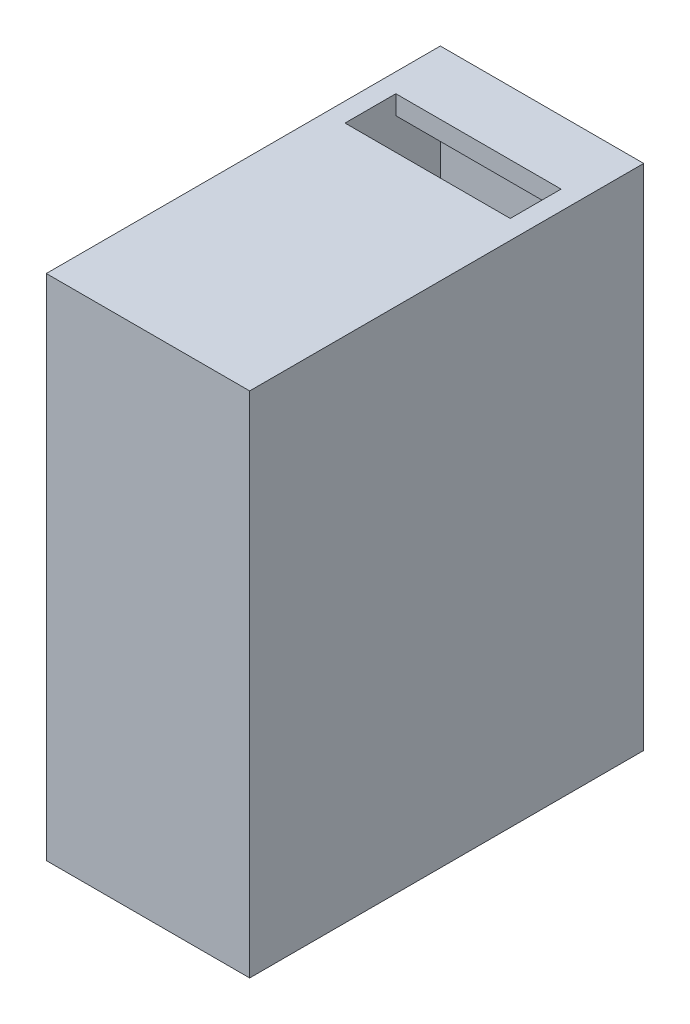
ISO-10303-21;
HEADER;
FILE_DESCRIPTION(('STEP AP214'),'2;1');
FILE_NAME('part.step','',(''),(''),'','','');
FILE_SCHEMA(('AUTOMOTIVE_DESIGN { 1 0 10303 214 1 1 1 1 }'));
ENDSEC;
DATA;
#1=APPLICATION_CONTEXT('core data for automotive mechanical design processes');
#2=APPLICATION_PROTOCOL_DEFINITION('international standard','automotive_design',2000,#1);
#3=PRODUCT_CONTEXT('',#1,'mechanical');
#4=PRODUCT('Part','Part','',(#3));
#5=PRODUCT_RELATED_PRODUCT_CATEGORY('part','',(#4));
#6=PRODUCT_DEFINITION_FORMATION('','',#4);
#7=PRODUCT_DEFINITION_CONTEXT('part definition',#1,'design');
#8=PRODUCT_DEFINITION('design','',#6,#7);
#9=PRODUCT_DEFINITION_SHAPE('','',#8);
#10=(LENGTH_UNIT() NAMED_UNIT(*) SI_UNIT(.MILLI.,.METRE.));
#11=(NAMED_UNIT(*) PLANE_ANGLE_UNIT() SI_UNIT($,.RADIAN.));
#12=(NAMED_UNIT(*) SI_UNIT($,.STERADIAN.) SOLID_ANGLE_UNIT());
#13=UNCERTAINTY_MEASURE_WITH_UNIT(LENGTH_MEASURE(1.E-05),#10,'distance_accuracy_value','');
#14=(GEOMETRIC_REPRESENTATION_CONTEXT(3) GLOBAL_UNCERTAINTY_ASSIGNED_CONTEXT((#13)) GLOBAL_UNIT_ASSIGNED_CONTEXT((#10,
#11,#12)) REPRESENTATION_CONTEXT('',''));
#15=CARTESIAN_POINT('',(0.,0.,0.));
#16=DIRECTION('',(0.,0.,1.));
#17=DIRECTION('',(1.,0.,0.));
#18=AXIS2_PLACEMENT_3D('',#15,#16,#17);
#19=CARTESIAN_POINT('',(0.,38.5,0.));
#20=DIRECTION('',(0.,1.,0.));
#21=DIRECTION('',(0.,0.,1.));
#22=AXIS2_PLACEMENT_3D('',#19,#20,#21);
#23=PLANE('',#22);
#24=DIRECTION('',(0.,0.,-1.));
#25=VECTOR('',#24,1.);
#26=CARTESIAN_POINT('',(14.5,38.5,0.));
#27=LINE('',#26,#25);
#28=CARTESIAN_POINT('',(14.5,38.5,5.));
#29=VERTEX_POINT('',#28);
#30=CARTESIAN_POINT('',(14.5,38.5,1.5));
#31=VERTEX_POINT('',#30);
#32=EDGE_CURVE('E262',#29,#31,#27,.T.);
#33=ORIENTED_EDGE('',*,*,#32,.F.);
#34=DIRECTION('',(-1.,0.,0.));
#35=VECTOR('',#34,1.);
#36=CARTESIAN_POINT('',(1.5,38.5,5.));
#37=LINE('',#36,#35);
#38=CARTESIAN_POINT('',(1.5,38.5,5.));
#39=VERTEX_POINT('',#38);
#40=EDGE_CURVE('E208',#29,#39,#37,.T.);
#41=ORIENTED_EDGE('',*,*,#40,.T.);
#42=DIRECTION('',(0.,0.,1.));
#43=VECTOR('',#42,1.);
#44=CARTESIAN_POINT('',(1.5,38.5,0.));
#45=LINE('',#44,#43);
#46=CARTESIAN_POINT('',(1.5,38.5,1.5));
#47=VERTEX_POINT('',#46);
#48=EDGE_CURVE('E244',#47,#39,#45,.T.);
#49=ORIENTED_EDGE('',*,*,#48,.F.);
#50=DIRECTION('',(-1.,0.,0.));
#51=VECTOR('',#50,1.);
#52=CARTESIAN_POINT('',(0.,38.5,1.5));
#53=LINE('',#52,#51);
#54=EDGE_CURVE('E270',#31,#47,#53,.T.);
#55=ORIENTED_EDGE('',*,*,#54,.F.);
#56=EDGE_LOOP('',(#33,#41,#49,#55));
#57=FACE_BOUND('',#56,.T.);
#58=ADVANCED_FACE('F39',(#57),#23,.F.);
#59=CARTESIAN_POINT('',(0.,40.,0.));
#60=DIRECTION('',(1.,0.,0.));
#61=DIRECTION('',(0.,0.,-1.));
#62=AXIS2_PLACEMENT_3D('',#59,#60,#61);
#63=PLANE('',#62);
#64=DIRECTION('',(0.,0.,1.));
#65=VECTOR('',#64,1.);
#66=CARTESIAN_POINT('',(0.,0.,0.));
#67=LINE('',#66,#65);
#68=CARTESIAN_POINT('',(0.,0.,0.));
#69=VERTEX_POINT('',#68);
#70=CARTESIAN_POINT('',(0.,0.,31.));
#71=VERTEX_POINT('',#70);
#72=EDGE_CURVE('E242',#69,#71,#67,.T.);
#73=ORIENTED_EDGE('',*,*,#72,.T.);
#74=DIRECTION('',(0.,-1.,0.));
#75=VECTOR('',#74,1.);
#76=CARTESIAN_POINT('',(0.,40.,31.));
#77=LINE('',#76,#75);
#78=CARTESIAN_POINT('',(0.,40.,31.));
#79=VERTEX_POINT('',#78);
#80=EDGE_CURVE('E323',#79,#71,#77,.T.);
#81=ORIENTED_EDGE('',*,*,#80,.F.);
#82=DIRECTION('',(0.,0.,1.));
#83=VECTOR('',#82,1.);
#84=CARTESIAN_POINT('',(0.,40.,0.));
#85=LINE('',#84,#83);
#86=CARTESIAN_POINT('',(0.,40.,0.));
#87=VERTEX_POINT('',#86);
#88=EDGE_CURVE('E284',#87,#79,#85,.T.);
#89=ORIENTED_EDGE('',*,*,#88,.F.);
#90=DIRECTION('',(0.,-1.,0.));
#91=VECTOR('',#90,1.);
#92=CARTESIAN_POINT('',(0.,40.,0.));
#93=LINE('',#92,#91);
#94=EDGE_CURVE('E298',#87,#69,#93,.T.);
#95=ORIENTED_EDGE('',*,*,#94,.T.);
#96=EDGE_LOOP('',(#73,#81,#89,#95));
#97=FACE_BOUND('',#96,.T.);
#98=ADVANCED_FACE('F41',(#97),#63,.F.);
#99=CARTESIAN_POINT('',(0.,40.,31.));
#100=DIRECTION('',(0.,0.,-1.));
#101=DIRECTION('',(-1.,0.,0.));
#102=AXIS2_PLACEMENT_3D('',#99,#100,#101);
#103=PLANE('',#102);
#104=DIRECTION('',(1.,0.,0.));
#105=VECTOR('',#104,1.);
#106=CARTESIAN_POINT('',(0.,0.,31.));
#107=LINE('',#106,#105);
#108=CARTESIAN_POINT('',(16.,0.,31.));
#109=VERTEX_POINT('',#108);
#110=EDGE_CURVE('E302',#71,#109,#107,.T.);
#111=ORIENTED_EDGE('',*,*,#110,.T.);
#112=DIRECTION('',(0.,-1.,0.));
#113=VECTOR('',#112,1.);
#114=CARTESIAN_POINT('',(16.,40.,31.));
#115=LINE('',#114,#113);
#116=CARTESIAN_POINT('',(16.,40.,31.));
#117=VERTEX_POINT('',#116);
#118=EDGE_CURVE('E319',#117,#109,#115,.T.);
#119=ORIENTED_EDGE('',*,*,#118,.F.);
#120=DIRECTION('',(1.,0.,0.));
#121=VECTOR('',#120,1.);
#122=CARTESIAN_POINT('',(0.,40.,31.));
#123=LINE('',#122,#121);
#124=EDGE_CURVE('E288',#79,#117,#123,.T.);
#125=ORIENTED_EDGE('',*,*,#124,.F.);
#126=ORIENTED_EDGE('',*,*,#80,.T.);
#127=EDGE_LOOP('',(#111,#119,#125,#126));
#128=FACE_BOUND('',#127,.T.);
#129=ADVANCED_FACE('F400',(#128),#103,.F.);
#130=CARTESIAN_POINT('',(16.,40.,0.));
#131=DIRECTION('',(-1.,0.,0.));
#132=DIRECTION('',(0.,0.,1.));
#133=AXIS2_PLACEMENT_3D('',#130,#131,#132);
#134=PLANE('',#133);
#135=DIRECTION('',(0.,0.,-1.));
#136=VECTOR('',#135,1.);
#137=CARTESIAN_POINT('',(16.,0.,0.));
#138=LINE('',#137,#136);
#139=CARTESIAN_POINT('',(16.,0.,0.));
#140=VERTEX_POINT('',#139);
#141=EDGE_CURVE('E305',#109,#140,#138,.T.);
#142=ORIENTED_EDGE('',*,*,#141,.T.);
#143=DIRECTION('',(0.,-1.,0.));
#144=VECTOR('',#143,1.);
#145=CARTESIAN_POINT('',(16.,40.,0.));
#146=LINE('',#145,#144);
#147=CARTESIAN_POINT('',(16.,40.,0.));
#148=VERTEX_POINT('',#147);
#149=EDGE_CURVE('E315',#148,#140,#146,.T.);
#150=ORIENTED_EDGE('',*,*,#149,.F.);
#151=DIRECTION('',(0.,0.,-1.));
#152=VECTOR('',#151,1.);
#153=CARTESIAN_POINT('',(16.,40.,0.));
#154=LINE('',#153,#152);
#155=EDGE_CURVE('E292',#117,#148,#154,.T.);
#156=ORIENTED_EDGE('',*,*,#155,.F.);
#157=ORIENTED_EDGE('',*,*,#118,.T.);
#158=EDGE_LOOP('',(#142,#150,#156,#157));
#159=FACE_BOUND('',#158,.T.);
#160=ADVANCED_FACE('F427',(#159),#134,.F.);
#161=CARTESIAN_POINT('',(0.,40.,0.));
#162=DIRECTION('',(0.,0.,1.));
#163=DIRECTION('',(1.,0.,0.));
#164=AXIS2_PLACEMENT_3D('',#161,#162,#163);
#165=PLANE('',#164);
#166=DIRECTION('',(-1.,0.,0.));
#167=VECTOR('',#166,1.);
#168=CARTESIAN_POINT('',(0.,0.,0.));
#169=LINE('',#168,#167);
#170=CARTESIAN_POINT('',(14.7811411966479,0.,0.));
#171=VERTEX_POINT('',#170);
#172=EDGE_CURVE('E289',#140,#171,#169,.T.);
#173=ORIENTED_EDGE('',*,*,#172,.T.);
#174=DIRECTION('',(0.,-1.,0.));
#175=VECTOR('',#174,1.);
#176=CARTESIAN_POINT('',(14.7811411966479,20.,0.));
#177=LINE('',#176,#175);
#178=CARTESIAN_POINT('',(14.7811411966479,20.,0.));
#179=VERTEX_POINT('',#178);
#180=EDGE_CURVE('E191',#179,#171,#177,.T.);
#181=ORIENTED_EDGE('',*,*,#180,.F.);
#182=DIRECTION('',(1.,0.,0.));
#183=VECTOR('',#182,1.);
#184=CARTESIAN_POINT('',(14.7811411966479,20.,0.));
#185=LINE('',#184,#183);
#186=CARTESIAN_POINT('',(1.28114119664788,20.,0.));
#187=VERTEX_POINT('',#186);
#188=EDGE_CURVE('E196',#187,#179,#185,.T.);
#189=ORIENTED_EDGE('',*,*,#188,.F.);
#190=DIRECTION('',(0.,1.,0.));
#191=VECTOR('',#190,1.);
#192=CARTESIAN_POINT('',(1.28114119664788,20.,0.));
#193=LINE('',#192,#191);
#194=CARTESIAN_POINT('',(1.28114119664787,0.,0.));
#195=VERTEX_POINT('',#194);
#196=EDGE_CURVE('E177',#195,#187,#193,.T.);
#197=ORIENTED_EDGE('',*,*,#196,.F.);
#198=EDGE_CURVE('E308',#195,#69,#169,.T.);
#199=ORIENTED_EDGE('',*,*,#198,.T.);
#200=ORIENTED_EDGE('',*,*,#94,.F.);
#201=DIRECTION('',(-1.,0.,0.));
#202=VECTOR('',#201,1.);
#203=CARTESIAN_POINT('',(0.,40.,0.));
#204=LINE('',#203,#202);
#205=EDGE_CURVE('E295',#148,#87,#204,.T.);
#206=ORIENTED_EDGE('',*,*,#205,.F.);
#207=ORIENTED_EDGE('',*,*,#149,.T.);
#208=EDGE_LOOP('',(#173,#181,#189,#197,#199,#200,#206,#207));
#209=FACE_BOUND('',#208,.T.);
#210=ADVANCED_FACE('F336',(#209),#165,.F.);
#211=CARTESIAN_POINT('',(0.,40.,0.));
#212=DIRECTION('',(0.,1.,0.));
#213=DIRECTION('',(0.,0.,1.));
#214=AXIS2_PLACEMENT_3D('',#211,#212,#213);
#215=PLANE('',#214);
#216=DIRECTION('',(0.,0.,1.));
#217=VECTOR('',#216,1.);
#218=CARTESIAN_POINT('',(1.5,40.,5.));
#219=LINE('',#218,#217);
#220=CARTESIAN_POINT('',(1.5,40.,5.));
#221=VERTEX_POINT('',#220);
#222=CARTESIAN_POINT('',(1.50000000000001,40.,9.));
#223=VERTEX_POINT('',#222);
#224=EDGE_CURVE('E204',#221,#223,#219,.T.);
#225=ORIENTED_EDGE('',*,*,#224,.F.);
#226=DIRECTION('',(-1.,0.,0.));
#227=VECTOR('',#226,1.);
#228=CARTESIAN_POINT('',(1.5,40.,5.));
#229=LINE('',#228,#227);
#230=CARTESIAN_POINT('',(14.5,40.,5.));
#231=VERTEX_POINT('',#230);
#232=EDGE_CURVE('E209',#231,#221,#229,.T.);
#233=ORIENTED_EDGE('',*,*,#232,.F.);
#234=DIRECTION('',(0.,0.,-1.));
#235=VECTOR('',#234,1.);
#236=CARTESIAN_POINT('',(14.5,40.,5.));
#237=LINE('',#236,#235);
#238=CARTESIAN_POINT('',(14.5,40.,9.));
#239=VERTEX_POINT('',#238);
#240=EDGE_CURVE('E219',#239,#231,#237,.T.);
#241=ORIENTED_EDGE('',*,*,#240,.F.);
#242=DIRECTION('',(1.,0.,0.));
#243=VECTOR('',#242,1.);
#244=CARTESIAN_POINT('',(1.50000000000001,40.,9.));
#245=LINE('',#244,#243);
#246=EDGE_CURVE('E216',#223,#239,#245,.T.);
#247=ORIENTED_EDGE('',*,*,#246,.F.);
#248=EDGE_LOOP('',(#225,#233,#241,#247));
#249=FACE_BOUND('',#248,.T.);
#250=ORIENTED_EDGE('',*,*,#88,.T.);
#251=ORIENTED_EDGE('',*,*,#124,.T.);
#252=ORIENTED_EDGE('',*,*,#155,.T.);
#253=ORIENTED_EDGE('',*,*,#205,.T.);
#254=EDGE_LOOP('',(#250,#251,#252,#253));
#255=FACE_BOUND('',#254,.T.);
#256=ADVANCED_FACE('F365',(#249,#255),#215,.T.);
#257=CARTESIAN_POINT('',(0.,0.,0.));
#258=DIRECTION('',(0.,1.,0.));
#259=DIRECTION('',(0.,0.,1.));
#260=AXIS2_PLACEMENT_3D('',#257,#258,#259);
#261=PLANE('',#260);
#262=DIRECTION('',(-1.,0.,0.));
#263=VECTOR('',#262,1.);
#264=CARTESIAN_POINT('',(0.,0.,1.5));
#265=LINE('',#264,#263);
#266=CARTESIAN_POINT('',(14.7811411966479,0.,1.5));
#267=VERTEX_POINT('',#266);
#268=CARTESIAN_POINT('',(14.5,0.,1.5));
#269=VERTEX_POINT('',#268);
#270=EDGE_CURVE('E201',#267,#269,#265,.T.);
#271=ORIENTED_EDGE('',*,*,#270,.F.);
#272=DIRECTION('',(0.,0.,-1.));
#273=VECTOR('',#272,1.);
#274=CARTESIAN_POINT('',(14.7811411966479,0.,0.));
#275=LINE('',#274,#273);
#276=EDGE_CURVE('E11',#267,#171,#275,.T.);
#277=ORIENTED_EDGE('',*,*,#276,.T.);
#278=ORIENTED_EDGE('',*,*,#172,.F.);
#279=ORIENTED_EDGE('',*,*,#141,.F.);
#280=ORIENTED_EDGE('',*,*,#110,.F.);
#281=ORIENTED_EDGE('',*,*,#72,.F.);
#282=ORIENTED_EDGE('',*,*,#198,.F.);
#283=DIRECTION('',(0.,0.,1.));
#284=VECTOR('',#283,1.);
#285=CARTESIAN_POINT('',(1.28114119664787,0.,0.));
#286=LINE('',#285,#284);
#287=CARTESIAN_POINT('',(1.28114119664787,0.,1.5));
#288=VERTEX_POINT('',#287);
#289=EDGE_CURVE('E48',#195,#288,#286,.T.);
#290=ORIENTED_EDGE('',*,*,#289,.T.);
#291=CARTESIAN_POINT('',(1.5,0.,1.5));
#292=VERTEX_POINT('',#291);
#293=EDGE_CURVE('E167',#292,#288,#265,.T.);
#294=ORIENTED_EDGE('',*,*,#293,.F.);
#295=DIRECTION('',(0.,0.,1.));
#296=VECTOR('',#295,1.);
#297=CARTESIAN_POINT('',(1.5,0.,0.));
#298=LINE('',#297,#296);
#299=CARTESIAN_POINT('',(1.5,0.,29.5));
#300=VERTEX_POINT('',#299);
#301=EDGE_CURVE('E229',#292,#300,#298,.T.);
#302=ORIENTED_EDGE('',*,*,#301,.T.);
#303=DIRECTION('',(1.,0.,0.));
#304=VECTOR('',#303,1.);
#305=CARTESIAN_POINT('',(0.,0.,29.5));
#306=LINE('',#305,#304);
#307=CARTESIAN_POINT('',(14.5,0.,29.5));
#308=VERTEX_POINT('',#307);
#309=EDGE_CURVE('E276',#300,#308,#306,.T.);
#310=ORIENTED_EDGE('',*,*,#309,.T.);
#311=DIRECTION('',(0.,0.,-1.));
#312=VECTOR('',#311,1.);
#313=CARTESIAN_POINT('',(14.5,0.,0.));
#314=LINE('',#313,#312);
#315=EDGE_CURVE('E277',#308,#269,#314,.T.);
#316=ORIENTED_EDGE('',*,*,#315,.T.);
#317=EDGE_LOOP('',(#271,#277,#278,#279,#280,#281,#282,#290,#294,#302,#310,#316));
#318=FACE_BOUND('',#317,.T.);
#319=ADVANCED_FACE('F332',(#318),#261,.F.);
#320=CARTESIAN_POINT('',(1.5,40.,0.));
#321=DIRECTION('',(1.,0.,0.));
#322=DIRECTION('',(0.,0.,-1.));
#323=AXIS2_PLACEMENT_3D('',#320,#321,#322);
#324=PLANE('',#323);
#325=ORIENTED_EDGE('',*,*,#301,.F.);
#326=DIRECTION('',(0.,-1.,0.));
#327=VECTOR('',#326,1.);
#328=CARTESIAN_POINT('',(1.5,40.,1.5));
#329=LINE('',#328,#327);
#330=CARTESIAN_POINT('',(1.5,20.,1.5));
#331=VERTEX_POINT('',#330);
#332=EDGE_CURVE('E255',#331,#292,#329,.T.);
#333=ORIENTED_EDGE('',*,*,#332,.F.);
#334=EDGE_CURVE('E250',#47,#331,#329,.T.);
#335=ORIENTED_EDGE('',*,*,#334,.F.);
#336=ORIENTED_EDGE('',*,*,#48,.T.);
#337=DIRECTION('',(0.,1.,0.));
#338=VECTOR('',#337,1.);
#339=CARTESIAN_POINT('',(1.5,38.5,5.));
#340=LINE('',#339,#338);
#341=EDGE_CURVE('E226',#39,#221,#340,.T.);
#342=ORIENTED_EDGE('',*,*,#341,.T.);
#343=ORIENTED_EDGE('',*,*,#224,.T.);
#344=DIRECTION('',(0.,1.,0.));
#345=VECTOR('',#344,1.);
#346=CARTESIAN_POINT('',(1.50000000000001,38.5,9.));
#347=LINE('',#346,#345);
#348=CARTESIAN_POINT('',(1.50000000000001,38.5,9.));
#349=VERTEX_POINT('',#348);
#350=EDGE_CURVE('E213',#349,#223,#347,.T.);
#351=ORIENTED_EDGE('',*,*,#350,.F.);
#352=CARTESIAN_POINT('',(1.5,38.5,29.5));
#353=VERTEX_POINT('',#352);
#354=EDGE_CURVE('E249',#349,#353,#45,.T.);
#355=ORIENTED_EDGE('',*,*,#354,.T.);
#356=DIRECTION('',(0.,-1.,0.));
#357=VECTOR('',#356,1.);
#358=CARTESIAN_POINT('',(1.5,40.,29.5));
#359=LINE('',#358,#357);
#360=EDGE_CURVE('E238',#353,#300,#359,.T.);
#361=ORIENTED_EDGE('',*,*,#360,.T.);
#362=EDGE_LOOP('',(#325,#333,#335,#336,#342,#343,#351,#355,#361));
#363=FACE_BOUND('',#362,.T.);
#364=ADVANCED_FACE('F380',(#363),#324,.T.);
#365=CARTESIAN_POINT('',(0.,40.,29.5));
#366=DIRECTION('',(0.,0.,-1.));
#367=DIRECTION('',(-1.,0.,0.));
#368=AXIS2_PLACEMENT_3D('',#365,#366,#367);
#369=PLANE('',#368);
#370=ORIENTED_EDGE('',*,*,#309,.F.);
#371=ORIENTED_EDGE('',*,*,#360,.F.);
#372=DIRECTION('',(1.,0.,0.));
#373=VECTOR('',#372,1.);
#374=CARTESIAN_POINT('',(0.,38.5,29.5));
#375=LINE('',#374,#373);
#376=CARTESIAN_POINT('',(14.5,38.5,29.5));
#377=VERTEX_POINT('',#376);
#378=EDGE_CURVE('E248',#353,#377,#375,.T.);
#379=ORIENTED_EDGE('',*,*,#378,.T.);
#380=DIRECTION('',(0.,-1.,0.));
#381=VECTOR('',#380,1.);
#382=CARTESIAN_POINT('',(14.5,40.,29.5));
#383=LINE('',#382,#381);
#384=EDGE_CURVE('E243',#377,#308,#383,.T.);
#385=ORIENTED_EDGE('',*,*,#384,.T.);
#386=EDGE_LOOP('',(#370,#371,#379,#385));
#387=FACE_BOUND('',#386,.T.);
#388=ADVANCED_FACE('F353',(#387),#369,.T.);
#389=CARTESIAN_POINT('',(14.5,40.,0.));
#390=DIRECTION('',(-1.,0.,0.));
#391=DIRECTION('',(0.,0.,1.));
#392=AXIS2_PLACEMENT_3D('',#389,#390,#391);
#393=PLANE('',#392);
#394=ORIENTED_EDGE('',*,*,#315,.F.);
#395=ORIENTED_EDGE('',*,*,#384,.F.);
#396=CARTESIAN_POINT('',(14.5,38.5,9.));
#397=VERTEX_POINT('',#396);
#398=EDGE_CURVE('E266',#377,#397,#27,.T.);
#399=ORIENTED_EDGE('',*,*,#398,.T.);
#400=DIRECTION('',(0.,1.,0.));
#401=VECTOR('',#400,1.);
#402=CARTESIAN_POINT('',(14.5,38.5,9.));
#403=LINE('',#402,#401);
#404=EDGE_CURVE('E63',#397,#239,#403,.T.);
#405=ORIENTED_EDGE('',*,*,#404,.T.);
#406=ORIENTED_EDGE('',*,*,#240,.T.);
#407=DIRECTION('',(0.,1.,0.));
#408=VECTOR('',#407,1.);
#409=CARTESIAN_POINT('',(14.5,38.5,5.));
#410=LINE('',#409,#408);
#411=EDGE_CURVE('E230',#29,#231,#410,.T.);
#412=ORIENTED_EDGE('',*,*,#411,.F.);
#413=ORIENTED_EDGE('',*,*,#32,.T.);
#414=DIRECTION('',(0.,-1.,0.));
#415=VECTOR('',#414,1.);
#416=CARTESIAN_POINT('',(14.5,40.,1.5));
#417=LINE('',#416,#415);
#418=CARTESIAN_POINT('',(14.5,20.,1.5));
#419=VERTEX_POINT('',#418);
#420=EDGE_CURVE('E259',#31,#419,#417,.T.);
#421=ORIENTED_EDGE('',*,*,#420,.T.);
#422=EDGE_CURVE('E254',#419,#269,#417,.T.);
#423=ORIENTED_EDGE('',*,*,#422,.T.);
#424=EDGE_LOOP('',(#394,#395,#399,#405,#406,#412,#413,#421,#423));
#425=FACE_BOUND('',#424,.T.);
#426=ADVANCED_FACE('F350',(#425),#393,.T.);
#427=CARTESIAN_POINT('',(0.,40.,1.5));
#428=DIRECTION('',(0.,0.,1.));
#429=DIRECTION('',(1.,0.,0.));
#430=AXIS2_PLACEMENT_3D('',#427,#428,#429);
#431=PLANE('',#430);
#432=DIRECTION('',(-1.,0.,0.));
#433=VECTOR('',#432,1.);
#434=CARTESIAN_POINT('',(0.,20.,1.5));
#435=LINE('',#434,#433);
#436=EDGE_CURVE('E185',#419,#331,#435,.T.);
#437=ORIENTED_EDGE('',*,*,#436,.F.);
#438=ORIENTED_EDGE('',*,*,#420,.F.);
#439=ORIENTED_EDGE('',*,*,#54,.T.);
#440=ORIENTED_EDGE('',*,*,#334,.T.);
#441=EDGE_LOOP('',(#437,#438,#439,#440));
#442=FACE_BOUND('',#441,.T.);
#443=ADVANCED_FACE('F376',(#442),#431,.T.);
#444=ORIENTED_EDGE('',*,*,#354,.F.);
#445=DIRECTION('',(1.,0.,0.));
#446=VECTOR('',#445,1.);
#447=CARTESIAN_POINT('',(1.50000000000001,38.5,9.));
#448=LINE('',#447,#446);
#449=EDGE_CURVE('E205',#349,#397,#448,.T.);
#450=ORIENTED_EDGE('',*,*,#449,.T.);
#451=ORIENTED_EDGE('',*,*,#398,.F.);
#452=ORIENTED_EDGE('',*,*,#378,.F.);
#453=EDGE_LOOP('',(#444,#450,#451,#452));
#454=FACE_BOUND('',#453,.T.);
#455=ADVANCED_FACE('F358',(#454),#23,.F.);
#456=CARTESIAN_POINT('',(1.5,38.5,5.));
#457=DIRECTION('',(0.,0.,-1.));
#458=DIRECTION('',(-1.,0.,0.));
#459=AXIS2_PLACEMENT_3D('',#456,#457,#458);
#460=PLANE('',#459);
#461=ORIENTED_EDGE('',*,*,#232,.T.);
#462=ORIENTED_EDGE('',*,*,#341,.F.);
#463=ORIENTED_EDGE('',*,*,#40,.F.);
#464=ORIENTED_EDGE('',*,*,#411,.T.);
#465=EDGE_LOOP('',(#461,#462,#463,#464));
#466=FACE_BOUND('',#465,.T.);
#467=ADVANCED_FACE('F368',(#466),#460,.F.);
#468=CARTESIAN_POINT('',(1.50000000000001,38.5,9.));
#469=DIRECTION('',(0.,0.,1.));
#470=DIRECTION('',(1.,0.,0.));
#471=AXIS2_PLACEMENT_3D('',#468,#469,#470);
#472=PLANE('',#471);
#473=ORIENTED_EDGE('',*,*,#246,.T.);
#474=ORIENTED_EDGE('',*,*,#404,.F.);
#475=ORIENTED_EDGE('',*,*,#449,.F.);
#476=ORIENTED_EDGE('',*,*,#350,.T.);
#477=EDGE_LOOP('',(#473,#474,#475,#476));
#478=FACE_BOUND('',#477,.T.);
#479=ADVANCED_FACE('F362',(#478),#472,.F.);
#480=CARTESIAN_POINT('',(14.7811411966479,20.,1.5));
#481=DIRECTION('',(1.,0.,0.));
#482=DIRECTION('',(0.,1.,0.));
#483=AXIS2_PLACEMENT_3D('',#480,#481,#482);
#484=PLANE('',#483);
#485=DIRECTION('',(0.,-1.,0.));
#486=VECTOR('',#485,1.);
#487=CARTESIAN_POINT('',(14.7811411966479,20.,1.5));
#488=LINE('',#487,#486);
#489=CARTESIAN_POINT('',(14.7811411966479,20.,1.5));
#490=VERTEX_POINT('',#489);
#491=EDGE_CURVE('E171',#490,#267,#488,.T.);
#492=ORIENTED_EDGE('',*,*,#491,.F.);
#493=DIRECTION('',(0.,0.,-1.));
#494=VECTOR('',#493,1.);
#495=CARTESIAN_POINT('',(14.7811411966479,20.,1.5));
#496=LINE('',#495,#494);
#497=EDGE_CURVE('E181',#490,#179,#496,.T.);
#498=ORIENTED_EDGE('',*,*,#497,.T.);
#499=ORIENTED_EDGE('',*,*,#180,.T.);
#500=ORIENTED_EDGE('',*,*,#276,.F.);
#501=EDGE_LOOP('',(#492,#498,#499,#500));
#502=FACE_BOUND('',#501,.T.);
#503=ADVANCED_FACE('F342',(#502),#484,.F.);
#504=CARTESIAN_POINT('',(1.28114119664788,20.,1.5));
#505=DIRECTION('',(-1.,0.,0.));
#506=DIRECTION('',(0.,-1.,0.));
#507=AXIS2_PLACEMENT_3D('',#504,#505,#506);
#508=PLANE('',#507);
#509=ORIENTED_EDGE('',*,*,#196,.T.);
#510=DIRECTION('',(0.,0.,-1.));
#511=VECTOR('',#510,1.);
#512=CARTESIAN_POINT('',(1.28114119664788,20.,1.5));
#513=LINE('',#512,#511);
#514=CARTESIAN_POINT('',(1.28114119664788,20.,1.5));
#515=VERTEX_POINT('',#514);
#516=EDGE_CURVE('E174',#515,#187,#513,.T.);
#517=ORIENTED_EDGE('',*,*,#516,.F.);
#518=DIRECTION('',(0.,1.,0.));
#519=VECTOR('',#518,1.);
#520=CARTESIAN_POINT('',(1.28114119664788,20.,1.5));
#521=LINE('',#520,#519);
#522=EDGE_CURVE('E160',#288,#515,#521,.T.);
#523=ORIENTED_EDGE('',*,*,#522,.F.);
#524=ORIENTED_EDGE('',*,*,#289,.F.);
#525=EDGE_LOOP('',(#509,#517,#523,#524));
#526=FACE_BOUND('',#525,.T.);
#527=ADVANCED_FACE('F175',(#526),#508,.F.);
#528=CARTESIAN_POINT('',(0.,0.,1.5));
#529=DIRECTION('',(0.,0.,-1.));
#530=DIRECTION('',(-1.,0.,0.));
#531=AXIS2_PLACEMENT_3D('',#528,#529,#530);
#532=PLANE('',#531);
#533=ORIENTED_EDGE('',*,*,#270,.T.);
#534=ORIENTED_EDGE('',*,*,#422,.F.);
#535=DIRECTION('',(1.,0.,0.));
#536=VECTOR('',#535,1.);
#537=CARTESIAN_POINT('',(14.7811411966479,20.,1.5));
#538=LINE('',#537,#536);
#539=EDGE_CURVE('E55',#419,#490,#538,.T.);
#540=ORIENTED_EDGE('',*,*,#539,.T.);
#541=ORIENTED_EDGE('',*,*,#491,.T.);
#542=EDGE_LOOP('',(#533,#534,#540,#541));
#543=FACE_BOUND('',#542,.T.);
#544=ADVANCED_FACE('F345',(#543),#532,.T.);
#545=ORIENTED_EDGE('',*,*,#293,.T.);
#546=ORIENTED_EDGE('',*,*,#522,.T.);
#547=EDGE_CURVE('E164',#515,#331,#538,.T.);
#548=ORIENTED_EDGE('',*,*,#547,.T.);
#549=ORIENTED_EDGE('',*,*,#332,.T.);
#550=EDGE_LOOP('',(#545,#546,#548,#549));
#551=FACE_BOUND('',#550,.T.);
#552=ADVANCED_FACE('F162',(#551),#532,.T.);
#553=CARTESIAN_POINT('',(14.7811411966479,20.,1.5));
#554=DIRECTION('',(0.,1.,0.));
#555=DIRECTION('',(0.,0.,1.));
#556=AXIS2_PLACEMENT_3D('',#553,#554,#555);
#557=PLANE('',#556);
#558=ORIENTED_EDGE('',*,*,#188,.T.);
#559=ORIENTED_EDGE('',*,*,#497,.F.);
#560=ORIENTED_EDGE('',*,*,#539,.F.);
#561=ORIENTED_EDGE('',*,*,#436,.T.);
#562=ORIENTED_EDGE('',*,*,#547,.F.);
#563=ORIENTED_EDGE('',*,*,#516,.T.);
#564=EDGE_LOOP('',(#558,#559,#560,#561,#562,#563));
#565=FACE_BOUND('',#564,.T.);
#566=ADVANCED_FACE('F183',(#565),#557,.F.);
#567=CLOSED_SHELL('',(#58,#98,#129,#160,#210,#256,#319,#364,#388,#426,#443,#455,#467,#479,#503,
#527,#544,#552,#566));
#568=MANIFOLD_SOLID_BREP('B2',#567);
#569=ADVANCED_BREP_SHAPE_REPRESENTATION('',(#18,#568),#14);
#570=SHAPE_DEFINITION_REPRESENTATION(#9,#569);
ENDSEC;
END-ISO-10303-21;
